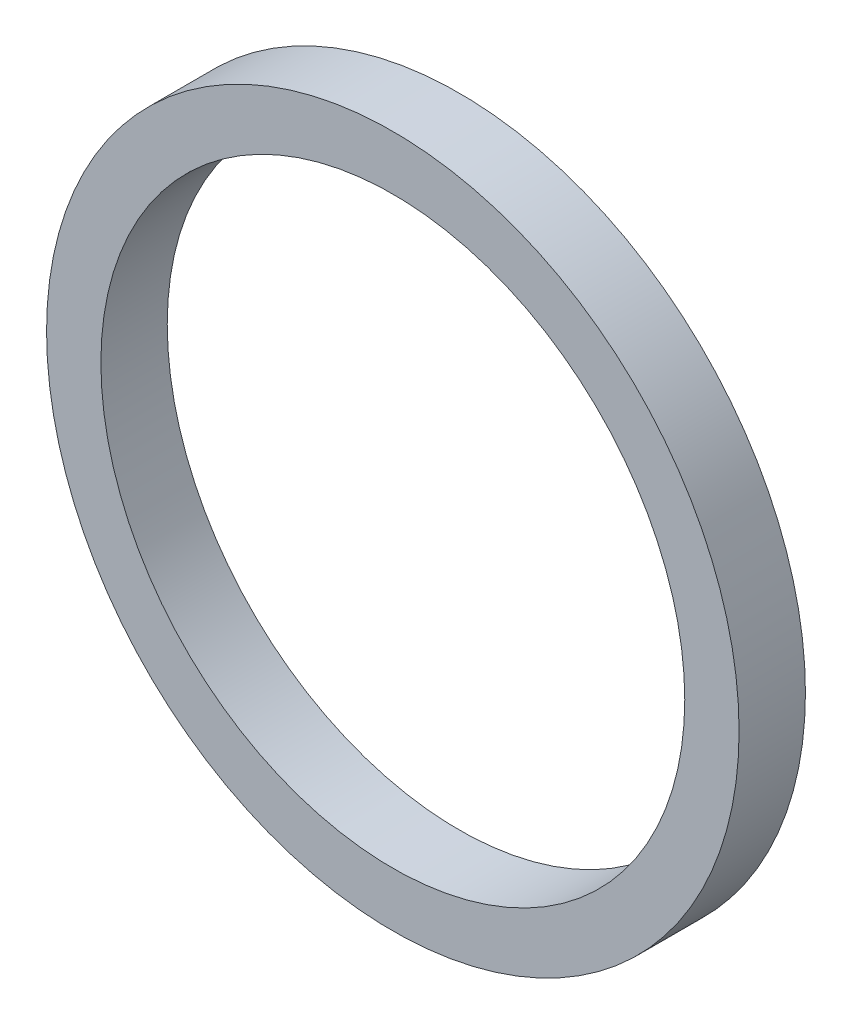
ISO-10303-21;
HEADER;
FILE_DESCRIPTION(('STEP AP214'),'2;1');
FILE_NAME('part.step','',(''),(''),'','','');
FILE_SCHEMA(('AUTOMOTIVE_DESIGN { 1 0 10303 214 1 1 1 1 }'));
ENDSEC;
DATA;
#1=APPLICATION_CONTEXT('core data for automotive mechanical design processes');
#2=APPLICATION_PROTOCOL_DEFINITION('international standard','automotive_design',2000,#1);
#3=PRODUCT_CONTEXT('',#1,'mechanical');
#4=PRODUCT('Part','Part','',(#3));
#5=PRODUCT_RELATED_PRODUCT_CATEGORY('part','',(#4));
#6=PRODUCT_DEFINITION_FORMATION('','',#4);
#7=PRODUCT_DEFINITION_CONTEXT('part definition',#1,'design');
#8=PRODUCT_DEFINITION('design','',#6,#7);
#9=PRODUCT_DEFINITION_SHAPE('','',#8);
#10=(LENGTH_UNIT() NAMED_UNIT(*) SI_UNIT(.MILLI.,.METRE.));
#11=(NAMED_UNIT(*) PLANE_ANGLE_UNIT() SI_UNIT($,.RADIAN.));
#12=(NAMED_UNIT(*) SI_UNIT($,.STERADIAN.) SOLID_ANGLE_UNIT());
#13=UNCERTAINTY_MEASURE_WITH_UNIT(LENGTH_MEASURE(1.E-05),#10,'distance_accuracy_value','');
#14=(GEOMETRIC_REPRESENTATION_CONTEXT(3) GLOBAL_UNCERTAINTY_ASSIGNED_CONTEXT((#13)) GLOBAL_UNIT_ASSIGNED_CONTEXT((#10,
#11,#12)) REPRESENTATION_CONTEXT('',''));
#15=CARTESIAN_POINT('',(0.,0.,0.));
#16=DIRECTION('',(0.,0.,1.));
#17=DIRECTION('',(1.,0.,0.));
#18=AXIS2_PLACEMENT_3D('',#15,#16,#17);
#19=CARTESIAN_POINT('',(0.,0.,0.));
#20=DIRECTION('',(0.,0.,-1.));
#21=DIRECTION('',(-1.,0.,0.));
#22=AXIS2_PLACEMENT_3D('',#19,#20,#21);
#23=CYLINDRICAL_SURFACE('',#22,20.875);
#24=CARTESIAN_POINT('',(0.,0.,4.));
#25=DIRECTION('',(0.,0.,-1.));
#26=DIRECTION('',(-1.,0.,0.));
#27=AXIS2_PLACEMENT_3D('',#24,#25,#26);
#28=CIRCLE('',#27,20.875);
#29=CARTESIAN_POINT('',(-20.875,0.,4.));
#30=VERTEX_POINT('',#29);
#31=EDGE_CURVE('E10',#30,#30,#28,.T.);
#32=ORIENTED_EDGE('',*,*,#31,.T.);
#33=EDGE_LOOP('',(#32));
#34=FACE_BOUND('',#33,.T.);
#35=CARTESIAN_POINT('',(0.,0.,0.));
#36=DIRECTION('',(0.,0.,-1.));
#37=DIRECTION('',(-1.,0.,0.));
#38=AXIS2_PLACEMENT_3D('',#35,#36,#37);
#39=CIRCLE('',#38,20.875);
#40=CARTESIAN_POINT('',(-20.875,0.,0.));
#41=VERTEX_POINT('',#40);
#42=EDGE_CURVE('E45',#41,#41,#39,.T.);
#43=ORIENTED_EDGE('',*,*,#42,.F.);
#44=EDGE_LOOP('',(#43));
#45=FACE_BOUND('',#44,.T.);
#46=ADVANCED_FACE('F31',(#34,#45),#23,.T.);
#47=CARTESIAN_POINT('',(0.,20.875,4.));
#48=DIRECTION('',(0.,0.,1.));
#49=DIRECTION('',(1.,0.,0.));
#50=AXIS2_PLACEMENT_3D('',#47,#48,#49);
#51=PLANE('',#50);
#52=CARTESIAN_POINT('',(0.,0.,4.));
#53=DIRECTION('',(0.,0.,-1.));
#54=DIRECTION('',(-1.,0.,0.));
#55=AXIS2_PLACEMENT_3D('',#52,#53,#54);
#56=CIRCLE('',#55,17.6);
#57=CARTESIAN_POINT('',(-17.6,0.,4.));
#58=VERTEX_POINT('',#57);
#59=EDGE_CURVE('E37',#58,#58,#56,.T.);
#60=ORIENTED_EDGE('',*,*,#59,.T.);
#61=EDGE_LOOP('',(#60));
#62=FACE_BOUND('',#61,.T.);
#63=ORIENTED_EDGE('',*,*,#31,.F.);
#64=EDGE_LOOP('',(#63));
#65=FACE_BOUND('',#64,.T.);
#66=ADVANCED_FACE('F55',(#62,#65),#51,.T.);
#67=CARTESIAN_POINT('',(0.,0.,0.));
#68=DIRECTION('',(0.,0.,-1.));
#69=DIRECTION('',(-1.,0.,0.));
#70=AXIS2_PLACEMENT_3D('',#67,#68,#69);
#71=CYLINDRICAL_SURFACE('',#70,17.6);
#72=CARTESIAN_POINT('',(0.,0.,0.));
#73=DIRECTION('',(0.,0.,-1.));
#74=DIRECTION('',(-1.,0.,0.));
#75=AXIS2_PLACEMENT_3D('',#72,#73,#74);
#76=CIRCLE('',#75,17.6);
#77=CARTESIAN_POINT('',(-17.6,0.,0.));
#78=VERTEX_POINT('',#77);
#79=EDGE_CURVE('E41',#78,#78,#76,.T.);
#80=ORIENTED_EDGE('',*,*,#79,.T.);
#81=EDGE_LOOP('',(#80));
#82=FACE_BOUND('',#81,.T.);
#83=ORIENTED_EDGE('',*,*,#59,.F.);
#84=EDGE_LOOP('',(#83));
#85=FACE_BOUND('',#84,.T.);
#86=ADVANCED_FACE('F59',(#82,#85),#71,.F.);
#87=CARTESIAN_POINT('',(0.,17.6,0.));
#88=DIRECTION('',(0.,0.,-1.));
#89=DIRECTION('',(-1.,0.,0.));
#90=AXIS2_PLACEMENT_3D('',#87,#88,#89);
#91=PLANE('',#90);
#92=ORIENTED_EDGE('',*,*,#42,.T.);
#93=EDGE_LOOP('',(#92));
#94=FACE_BOUND('',#93,.T.);
#95=ORIENTED_EDGE('',*,*,#79,.F.);
#96=EDGE_LOOP('',(#95));
#97=FACE_BOUND('',#96,.T.);
#98=ADVANCED_FACE('F51',(#94,#97),#91,.T.);
#99=CLOSED_SHELL('',(#46,#66,#86,#98));
#100=MANIFOLD_SOLID_BREP('B2',#99);
#101=ADVANCED_BREP_SHAPE_REPRESENTATION('',(#18,#100),#14);
#102=SHAPE_DEFINITION_REPRESENTATION(#9,#101);
ENDSEC;
END-ISO-10303-21;
